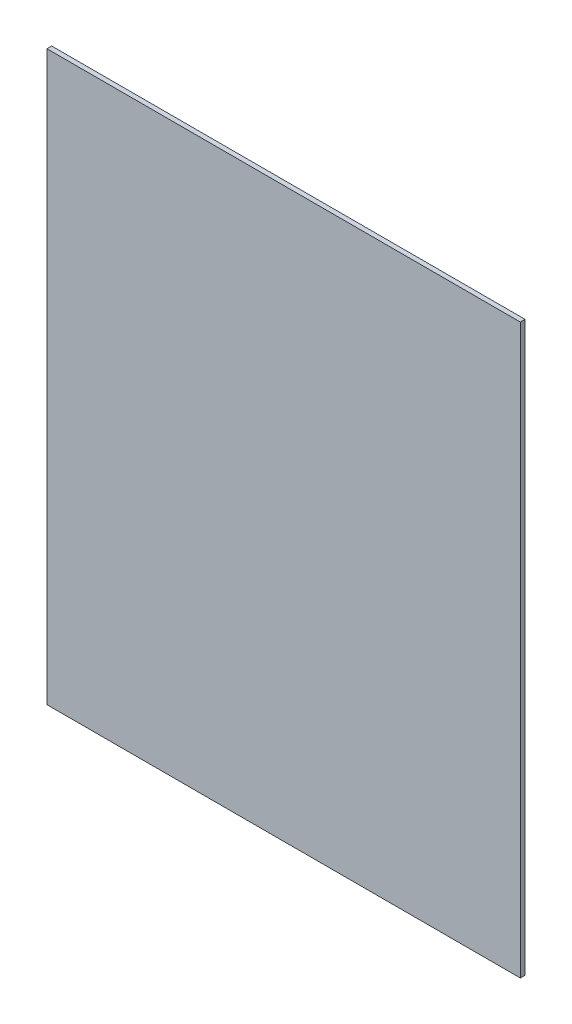
ISO-10303-21;
HEADER;
FILE_DESCRIPTION(('STEP AP214'),'2;1');
FILE_NAME('part.step','',(''),(''),'','','');
FILE_SCHEMA(('AUTOMOTIVE_DESIGN { 1 0 10303 214 1 1 1 1 }'));
ENDSEC;
DATA;
#1=APPLICATION_CONTEXT('core data for automotive mechanical design processes');
#2=APPLICATION_PROTOCOL_DEFINITION('international standard','automotive_design',2000,#1);
#3=PRODUCT_CONTEXT('',#1,'mechanical');
#4=PRODUCT('Part','Part','',(#3));
#5=PRODUCT_RELATED_PRODUCT_CATEGORY('part','',(#4));
#6=PRODUCT_DEFINITION_FORMATION('','',#4);
#7=PRODUCT_DEFINITION_CONTEXT('part definition',#1,'design');
#8=PRODUCT_DEFINITION('design','',#6,#7);
#9=PRODUCT_DEFINITION_SHAPE('','',#8);
#10=(LENGTH_UNIT() NAMED_UNIT(*) SI_UNIT(.MILLI.,.METRE.));
#11=(NAMED_UNIT(*) PLANE_ANGLE_UNIT() SI_UNIT($,.RADIAN.));
#12=(NAMED_UNIT(*) SI_UNIT($,.STERADIAN.) SOLID_ANGLE_UNIT());
#13=UNCERTAINTY_MEASURE_WITH_UNIT(LENGTH_MEASURE(1.E-05),#10,'distance_accuracy_value','');
#14=(GEOMETRIC_REPRESENTATION_CONTEXT(3) GLOBAL_UNCERTAINTY_ASSIGNED_CONTEXT((#13)) GLOBAL_UNIT_ASSIGNED_CONTEXT((#10,
#11,#12)) REPRESENTATION_CONTEXT('',''));
#15=CARTESIAN_POINT('',(0.,0.,0.));
#16=DIRECTION('',(0.,0.,1.));
#17=DIRECTION('',(1.,0.,0.));
#18=AXIS2_PLACEMENT_3D('',#15,#16,#17);
#19=CARTESIAN_POINT('',(-50.,-60.,1.));
#20=DIRECTION('',(1.,0.,0.));
#21=DIRECTION('',(0.,0.,-1.));
#22=AXIS2_PLACEMENT_3D('',#19,#20,#21);
#23=PLANE('',#22);
#24=DIRECTION('',(0.,-1.,0.));
#25=VECTOR('',#24,1.);
#26=CARTESIAN_POINT('',(-50.,-60.,0.));
#27=LINE('',#26,#25);
#28=CARTESIAN_POINT('',(-50.,60.,0.));
#29=VERTEX_POINT('',#28);
#30=CARTESIAN_POINT('',(-50.,-60.,0.));
#31=VERTEX_POINT('',#30);
#32=EDGE_CURVE('E96',#29,#31,#27,.T.);
#33=ORIENTED_EDGE('',*,*,#32,.T.);
#34=DIRECTION('',(0.,0.,-1.));
#35=VECTOR('',#34,1.);
#36=CARTESIAN_POINT('',(-50.,-60.,1.));
#37=LINE('',#36,#35);
#38=CARTESIAN_POINT('',(-50.,-60.,1.));
#39=VERTEX_POINT('',#38);
#40=EDGE_CURVE('E11',#39,#31,#37,.T.);
#41=ORIENTED_EDGE('',*,*,#40,.F.);
#42=DIRECTION('',(0.,-1.,0.));
#43=VECTOR('',#42,1.);
#44=CARTESIAN_POINT('',(-50.,-60.,1.));
#45=LINE('',#44,#43);
#46=CARTESIAN_POINT('',(-50.,60.,1.));
#47=VERTEX_POINT('',#46);
#48=EDGE_CURVE('E84',#47,#39,#45,.T.);
#49=ORIENTED_EDGE('',*,*,#48,.F.);
#50=DIRECTION('',(0.,0.,-1.));
#51=VECTOR('',#50,1.);
#52=CARTESIAN_POINT('',(-50.,60.,1.));
#53=LINE('',#52,#51);
#54=EDGE_CURVE('E92',#47,#29,#53,.T.);
#55=ORIENTED_EDGE('',*,*,#54,.T.);
#56=EDGE_LOOP('',(#33,#41,#49,#55));
#57=FACE_BOUND('',#56,.T.);
#58=ADVANCED_FACE('F33',(#57),#23,.F.);
#59=CARTESIAN_POINT('',(50.,-60.,1.));
#60=DIRECTION('',(0.,1.,0.));
#61=DIRECTION('',(-1.,0.,0.));
#62=AXIS2_PLACEMENT_3D('',#59,#60,#61);
#63=PLANE('',#62);
#64=DIRECTION('',(1.,0.,0.));
#65=VECTOR('',#64,1.);
#66=CARTESIAN_POINT('',(50.,-60.,0.));
#67=LINE('',#66,#65);
#68=CARTESIAN_POINT('',(50.,-60.,0.));
#69=VERTEX_POINT('',#68);
#70=EDGE_CURVE('E88',#31,#69,#67,.T.);
#71=ORIENTED_EDGE('',*,*,#70,.T.);
#72=DIRECTION('',(0.,0.,-1.));
#73=VECTOR('',#72,1.);
#74=CARTESIAN_POINT('',(50.,-60.,1.));
#75=LINE('',#74,#73);
#76=CARTESIAN_POINT('',(50.,-60.,1.));
#77=VERTEX_POINT('',#76);
#78=EDGE_CURVE('E41',#77,#69,#75,.T.);
#79=ORIENTED_EDGE('',*,*,#78,.F.);
#80=DIRECTION('',(1.,0.,0.));
#81=VECTOR('',#80,1.);
#82=CARTESIAN_POINT('',(50.,-60.,1.));
#83=LINE('',#82,#81);
#84=EDGE_CURVE('E79',#39,#77,#83,.T.);
#85=ORIENTED_EDGE('',*,*,#84,.F.);
#86=ORIENTED_EDGE('',*,*,#40,.T.);
#87=EDGE_LOOP('',(#71,#79,#85,#86));
#88=FACE_BOUND('',#87,.T.);
#89=ADVANCED_FACE('F87',(#88),#63,.F.);
#90=CARTESIAN_POINT('',(50.,-60.,1.));
#91=DIRECTION('',(-1.,0.,0.));
#92=DIRECTION('',(0.,0.,1.));
#93=AXIS2_PLACEMENT_3D('',#90,#91,#92);
#94=PLANE('',#93);
#95=DIRECTION('',(0.,1.,0.));
#96=VECTOR('',#95,1.);
#97=CARTESIAN_POINT('',(50.,-60.,0.));
#98=LINE('',#97,#96);
#99=CARTESIAN_POINT('',(50.,60.,0.));
#100=VERTEX_POINT('',#99);
#101=EDGE_CURVE('E66',#69,#100,#98,.T.);
#102=ORIENTED_EDGE('',*,*,#101,.T.);
#103=DIRECTION('',(0.,0.,-1.));
#104=VECTOR('',#103,1.);
#105=CARTESIAN_POINT('',(50.,60.,1.));
#106=LINE('',#105,#104);
#107=CARTESIAN_POINT('',(50.,60.,1.));
#108=VERTEX_POINT('',#107);
#109=EDGE_CURVE('E89',#108,#100,#106,.T.);
#110=ORIENTED_EDGE('',*,*,#109,.F.);
#111=DIRECTION('',(0.,1.,0.));
#112=VECTOR('',#111,1.);
#113=CARTESIAN_POINT('',(50.,-60.,1.));
#114=LINE('',#113,#112);
#115=EDGE_CURVE('E82',#77,#108,#114,.T.);
#116=ORIENTED_EDGE('',*,*,#115,.F.);
#117=ORIENTED_EDGE('',*,*,#78,.T.);
#118=EDGE_LOOP('',(#102,#110,#116,#117));
#119=FACE_BOUND('',#118,.T.);
#120=ADVANCED_FACE('F90',(#119),#94,.F.);
#121=CARTESIAN_POINT('',(50.,60.,1.));
#122=DIRECTION('',(0.,-1.,0.));
#123=DIRECTION('',(1.,0.,0.));
#124=AXIS2_PLACEMENT_3D('',#121,#122,#123);
#125=PLANE('',#124);
#126=DIRECTION('',(-1.,0.,0.));
#127=VECTOR('',#126,1.);
#128=CARTESIAN_POINT('',(50.,60.,0.));
#129=LINE('',#128,#127);
#130=EDGE_CURVE('E72',#100,#29,#129,.T.);
#131=ORIENTED_EDGE('',*,*,#130,.T.);
#132=ORIENTED_EDGE('',*,*,#54,.F.);
#133=DIRECTION('',(-1.,0.,0.));
#134=VECTOR('',#133,1.);
#135=CARTESIAN_POINT('',(50.,60.,1.));
#136=LINE('',#135,#134);
#137=EDGE_CURVE('E49',#108,#47,#136,.T.);
#138=ORIENTED_EDGE('',*,*,#137,.F.);
#139=ORIENTED_EDGE('',*,*,#109,.T.);
#140=EDGE_LOOP('',(#131,#132,#138,#139));
#141=FACE_BOUND('',#140,.T.);
#142=ADVANCED_FACE('F103',(#141),#125,.F.);
#143=CARTESIAN_POINT('',(0.,0.,1.));
#144=DIRECTION('',(0.,0.,1.));
#145=DIRECTION('',(1.,0.,0.));
#146=AXIS2_PLACEMENT_3D('',#143,#144,#145);
#147=PLANE('',#146);
#148=ORIENTED_EDGE('',*,*,#48,.T.);
#149=ORIENTED_EDGE('',*,*,#84,.T.);
#150=ORIENTED_EDGE('',*,*,#115,.T.);
#151=ORIENTED_EDGE('',*,*,#137,.T.);
#152=EDGE_LOOP('',(#148,#149,#150,#151));
#153=FACE_BOUND('',#152,.T.);
#154=ADVANCED_FACE('F80',(#153),#147,.T.);
#155=CARTESIAN_POINT('',(0.,0.,0.));
#156=DIRECTION('',(0.,0.,1.));
#157=DIRECTION('',(1.,0.,0.));
#158=AXIS2_PLACEMENT_3D('',#155,#156,#157);
#159=PLANE('',#158);
#160=ORIENTED_EDGE('',*,*,#32,.F.);
#161=ORIENTED_EDGE('',*,*,#130,.F.);
#162=ORIENTED_EDGE('',*,*,#101,.F.);
#163=ORIENTED_EDGE('',*,*,#70,.F.);
#164=EDGE_LOOP('',(#160,#161,#162,#163));
#165=FACE_BOUND('',#164,.T.);
#166=ADVANCED_FACE('F106',(#165),#159,.F.);
#167=CLOSED_SHELL('',(#58,#89,#120,#142,#154,#166));
#168=MANIFOLD_SOLID_BREP('B2',#167);
#169=ADVANCED_BREP_SHAPE_REPRESENTATION('',(#18,#168),#14);
#170=SHAPE_DEFINITION_REPRESENTATION(#9,#169);
ENDSEC;
END-ISO-10303-21;
